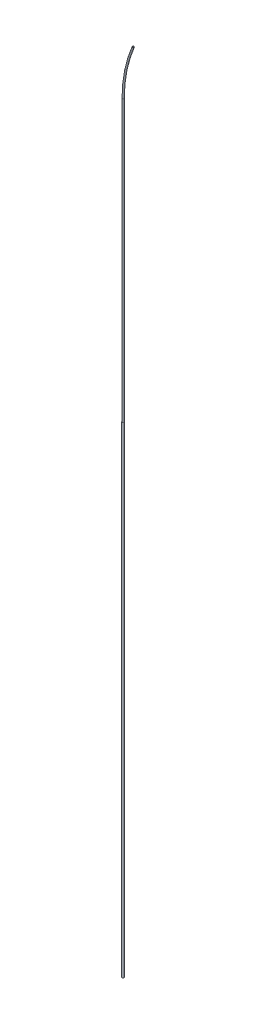
ISO-10303-21;
HEADER;
FILE_DESCRIPTION(('STEP AP214'),'2;1');
FILE_NAME('part.step','',(''),(''),'','','');
FILE_SCHEMA(('AUTOMOTIVE_DESIGN { 1 0 10303 214 1 1 1 1 }'));
ENDSEC;
DATA;
#1=APPLICATION_CONTEXT('core data for automotive mechanical design processes');
#2=APPLICATION_PROTOCOL_DEFINITION('international standard','automotive_design',2000,#1);
#3=PRODUCT_CONTEXT('',#1,'mechanical');
#4=PRODUCT('Part','Part','',(#3));
#5=PRODUCT_RELATED_PRODUCT_CATEGORY('part','',(#4));
#6=PRODUCT_DEFINITION_FORMATION('','',#4);
#7=PRODUCT_DEFINITION_CONTEXT('part definition',#1,'design');
#8=PRODUCT_DEFINITION('design','',#6,#7);
#9=PRODUCT_DEFINITION_SHAPE('','',#8);
#10=(LENGTH_UNIT() NAMED_UNIT(*) SI_UNIT(.MILLI.,.METRE.));
#11=(NAMED_UNIT(*) PLANE_ANGLE_UNIT() SI_UNIT($,.RADIAN.));
#12=(NAMED_UNIT(*) SI_UNIT($,.STERADIAN.) SOLID_ANGLE_UNIT());
#13=UNCERTAINTY_MEASURE_WITH_UNIT(LENGTH_MEASURE(1.E-05),#10,'distance_accuracy_value','');
#14=(GEOMETRIC_REPRESENTATION_CONTEXT(3) GLOBAL_UNCERTAINTY_ASSIGNED_CONTEXT((#13)) GLOBAL_UNIT_ASSIGNED_CONTEXT((#10,
#11,#12)) REPRESENTATION_CONTEXT('',''));
#15=CARTESIAN_POINT('',(0.,0.,0.));
#16=DIRECTION('',(0.,0.,1.));
#17=DIRECTION('',(1.,0.,0.));
#18=AXIS2_PLACEMENT_3D('',#15,#16,#17);
#19=CARTESIAN_POINT('',(0.,-368.,0.));
#20=DIRECTION('',(0.,-1.,0.));
#21=DIRECTION('',(0.,0.,-1.));
#22=AXIS2_PLACEMENT_3D('',#19,#20,#21);
#23=PLANE('',#22);
#24=CARTESIAN_POINT('',(0.,-368.,0.));
#25=DIRECTION('',(0.,-1.,0.));
#26=DIRECTION('',(0.,0.,-1.));
#27=AXIS2_PLACEMENT_3D('',#24,#25,#26);
#28=CIRCLE('',#27,0.8255);
#29=CARTESIAN_POINT('',(0.,-368.,-0.8255));
#30=VERTEX_POINT('',#29);
#31=EDGE_CURVE('E11',#30,#30,#28,.T.);
#32=ORIENTED_EDGE('',*,*,#31,.T.);
#33=EDGE_LOOP('',(#32));
#34=FACE_BOUND('',#33,.T.);
#35=CARTESIAN_POINT('',(0.,-368.,0.));
#36=DIRECTION('',(0.,-1.,0.));
#37=DIRECTION('',(0.,0.,-1.));
#38=AXIS2_PLACEMENT_3D('',#35,#36,#37);
#39=CIRCLE('',#38,0.673);
#40=CARTESIAN_POINT('',(0.,-368.,-0.673));
#41=VERTEX_POINT('',#40);
#42=EDGE_CURVE('E64',#41,#41,#39,.T.);
#43=ORIENTED_EDGE('',*,*,#42,.F.);
#44=EDGE_LOOP('',(#43));
#45=FACE_BOUND('',#44,.T.);
#46=ADVANCED_FACE('F51',(#34,#45),#23,.T.);
#47=CARTESIAN_POINT('',(0.,10.,0.));
#48=DIRECTION('',(0.,-1.,0.));
#49=DIRECTION('',(0.,0.,-1.));
#50=AXIS2_PLACEMENT_3D('',#47,#48,#49);
#51=PLANE('',#50);
#52=CARTESIAN_POINT('',(0.,10.,0.));
#53=DIRECTION('',(0.,-1.,0.));
#54=DIRECTION('',(0.,0.,-1.));
#55=AXIS2_PLACEMENT_3D('',#52,#53,#54);
#56=CIRCLE('',#55,0.8255);
#57=CARTESIAN_POINT('',(0.,10.,-0.8255));
#58=VERTEX_POINT('',#57);
#59=EDGE_CURVE('E55',#58,#58,#56,.T.);
#60=ORIENTED_EDGE('',*,*,#59,.F.);
#61=EDGE_LOOP('',(#60));
#62=FACE_BOUND('',#61,.T.);
#63=CARTESIAN_POINT('',(0.,10.,0.));
#64=DIRECTION('',(0.,-1.,0.));
#65=DIRECTION('',(0.,0.,-1.));
#66=AXIS2_PLACEMENT_3D('',#63,#64,#65);
#67=CIRCLE('',#66,0.673);
#68=CARTESIAN_POINT('',(0.,10.,-0.673));
#69=VERTEX_POINT('',#68);
#70=EDGE_CURVE('E66',#69,#69,#67,.T.);
#71=ORIENTED_EDGE('',*,*,#70,.T.);
#72=EDGE_LOOP('',(#71));
#73=FACE_BOUND('',#72,.T.);
#74=ADVANCED_FACE('F78',(#62,#73),#51,.F.);
#75=CARTESIAN_POINT('',(0.,-368.,0.));
#76=DIRECTION('',(0.,1.,0.));
#77=DIRECTION('',(0.,0.,1.));
#78=AXIS2_PLACEMENT_3D('',#75,#76,#77);
#79=CYLINDRICAL_SURFACE('',#78,0.8255);
#80=ORIENTED_EDGE('',*,*,#31,.F.);
#81=EDGE_LOOP('',(#80));
#82=FACE_BOUND('',#81,.T.);
#83=ORIENTED_EDGE('',*,*,#59,.T.);
#84=EDGE_LOOP('',(#83));
#85=FACE_BOUND('',#84,.T.);
#86=ADVANCED_FACE('F53',(#82,#85),#79,.T.);
#87=CARTESIAN_POINT('',(0.,-368.,0.));
#88=DIRECTION('',(0.,1.,0.));
#89=DIRECTION('',(0.,0.,1.));
#90=AXIS2_PLACEMENT_3D('',#87,#88,#89);
#91=CYLINDRICAL_SURFACE('',#90,0.673);
#92=ORIENTED_EDGE('',*,*,#42,.T.);
#93=EDGE_LOOP('',(#92));
#94=FACE_BOUND('',#93,.T.);
#95=ORIENTED_EDGE('',*,*,#70,.F.);
#96=EDGE_LOOP('',(#95));
#97=FACE_BOUND('',#96,.T.);
#98=ADVANCED_FACE('F74',(#94,#97),#91,.F.);
#99=CLOSED_SHELL('',(#46,#74,#86,#98));
#100=MANIFOLD_SOLID_BREP('B2',#99);
#101=CARTESIAN_POINT('',(0.,0.,0.));
#102=DIRECTION('',(0.,1.,0.));
#103=DIRECTION('',(0.,0.,1.));
#104=AXIS2_PLACEMENT_3D('',#101,#102,#103);
#105=PLANE('',#104);
#106=CARTESIAN_POINT('',(0.,0.,0.));
#107=DIRECTION('',(0.,1.,0.));
#108=DIRECTION('',(0.,0.,1.));
#109=AXIS2_PLACEMENT_3D('',#106,#107,#108);
#110=CIRCLE('',#109,0.635);
#111=CARTESIAN_POINT('',(0.,0.,0.635));
#112=VERTEX_POINT('',#111);
#113=EDGE_CURVE('E121',#112,#112,#110,.T.);
#114=ORIENTED_EDGE('',*,*,#113,.F.);
#115=EDGE_LOOP('',(#114));
#116=FACE_BOUND('',#115,.T.);
#117=CARTESIAN_POINT('',(0.,0.,0.));
#118=DIRECTION('',(0.,1.,0.));
#119=DIRECTION('',(0.,0.,1.));
#120=AXIS2_PLACEMENT_3D('',#117,#118,#119);
#121=CIRCLE('',#120,0.498);
#122=CARTESIAN_POINT('',(0.,0.,0.498));
#123=VERTEX_POINT('',#122);
#124=EDGE_CURVE('E128',#123,#123,#121,.T.);
#125=ORIENTED_EDGE('',*,*,#124,.T.);
#126=EDGE_LOOP('',(#125));
#127=FACE_BOUND('',#126,.T.);
#128=ADVANCED_FACE('F117',(#116,#127),#105,.F.);
#129=CARTESIAN_POINT('',(0.,230.,0.));
#130=DIRECTION('',(0.,-1.,0.));
#131=DIRECTION('',(0.,0.,-1.));
#132=AXIS2_PLACEMENT_3D('',#129,#130,#131);
#133=CYLINDRICAL_SURFACE('',#132,0.635);
#134=CARTESIAN_POINT('',(0.,230.,0.));
#135=DIRECTION('',(0.,1.,0.));
#136=DIRECTION('',(0.,0.,1.));
#137=AXIS2_PLACEMENT_3D('',#134,#135,#136);
#138=CIRCLE('',#137,0.635);
#139=CARTESIAN_POINT('',(-0.634999999999997,230.,0.));
#140=VERTEX_POINT('',#139);
#141=EDGE_CURVE('E50',#140,#140,#138,.T.);
#142=ORIENTED_EDGE('',*,*,#141,.F.);
#143=EDGE_LOOP('',(#142));
#144=FACE_BOUND('',#143,.T.);
#145=ORIENTED_EDGE('',*,*,#113,.T.);
#146=EDGE_LOOP('',(#145));
#147=FACE_BOUND('',#146,.T.);
#148=ADVANCED_FACE('F119',(#144,#147),#133,.T.);
#149=CARTESIAN_POINT('',(0.,230.,0.));
#150=DIRECTION('',(0.,-1.,0.));
#151=DIRECTION('',(0.,0.,-1.));
#152=AXIS2_PLACEMENT_3D('',#149,#150,#151);
#153=CYLINDRICAL_SURFACE('',#152,0.498);
#154=CARTESIAN_POINT('',(0.,230.,0.));
#155=DIRECTION('',(0.,1.,0.));
#156=DIRECTION('',(0.,0.,1.));
#157=AXIS2_PLACEMENT_3D('',#154,#155,#156);
#158=CIRCLE('',#157,0.498);
#159=CARTESIAN_POINT('',(-0.497999999999998,230.,0.));
#160=VERTEX_POINT('',#159);
#161=EDGE_CURVE('E136',#160,#160,#158,.F.);
#162=ORIENTED_EDGE('',*,*,#161,.F.);
#163=EDGE_LOOP('',(#162));
#164=FACE_BOUND('',#163,.T.);
#165=ORIENTED_EDGE('',*,*,#124,.F.);
#166=EDGE_LOOP('',(#165));
#167=FACE_BOUND('',#166,.T.);
#168=ADVANCED_FACE('F144',(#164,#167),#153,.F.);
#169=CARTESIAN_POINT('',(100.,230.,0.));
#170=DIRECTION('',(0.,0.,-1.));
#171=DIRECTION('',(-1.,0.,0.));
#172=AXIS2_PLACEMENT_3D('',#169,#170,#171);
#173=TOROIDAL_SURFACE('',#172,100.,0.635);
#174=CARTESIAN_POINT('',(7.89390059971148,268.941834230865,0.));
#175=DIRECTION('',(0.38941834230865,0.921060994002885,0.));
#176=DIRECTION('',(0.,0.,1.));
#177=AXIS2_PLACEMENT_3D('',#174,#175,#176);
#178=CIRCLE('',#177,0.635);
#179=CARTESIAN_POINT('',(7.30902686851966,269.189114878231,0.));
#180=VERTEX_POINT('',#179);
#181=EDGE_CURVE('E133',#180,#180,#178,.T.);
#182=CARTESIAN_POINT('',(100.,230.,0.));
#183=DIRECTION('',(0.,0.,-1.));
#184=DIRECTION('',(-1.,0.,0.));
#185=AXIS2_PLACEMENT_3D('',#182,#183,#184);
#186=CIRCLE('',#185,100.635);
#187=EDGE_CURVE('',#140,#180,#186,.T.);
#188=ORIENTED_EDGE('',*,*,#141,.T.);
#189=ORIENTED_EDGE('',*,*,#181,.F.);
#190=ORIENTED_EDGE('',*,*,#187,.T.);
#191=ORIENTED_EDGE('',*,*,#187,.F.);
#192=EDGE_LOOP('',(#188,#190,#189,#191));
#193=FACE_BOUND('',#192,.T.);
#194=ADVANCED_FACE('F147',(#193),#173,.T.);
#195=CARTESIAN_POINT('',(7.89390059971148,268.941834230865,0.));
#196=DIRECTION('',(0.38941834230865,0.921060994002885,0.));
#197=DIRECTION('',(0.,0.,1.));
#198=AXIS2_PLACEMENT_3D('',#195,#196,#197);
#199=PLANE('',#198);
#200=CARTESIAN_POINT('',(7.89390059971148,268.941834230865,0.));
#201=DIRECTION('',(0.38941834230865,0.921060994002885,0.));
#202=DIRECTION('',(0.,0.,1.));
#203=AXIS2_PLACEMENT_3D('',#200,#201,#202);
#204=CIRCLE('',#203,0.498);
#205=CARTESIAN_POINT('',(7.43521222469805,269.135764565335,0.));
#206=VERTEX_POINT('',#205);
#207=EDGE_CURVE('E132',#206,#206,#204,.F.);
#208=ORIENTED_EDGE('',*,*,#207,.T.);
#209=EDGE_LOOP('',(#208));
#210=FACE_BOUND('',#209,.T.);
#211=ORIENTED_EDGE('',*,*,#181,.T.);
#212=EDGE_LOOP('',(#211));
#213=FACE_BOUND('',#212,.T.);
#214=ADVANCED_FACE('F161',(#210,#213),#199,.T.);
#215=CARTESIAN_POINT('',(100.,230.,0.));
#216=DIRECTION('',(0.,0.,-1.));
#217=DIRECTION('',(-1.,0.,0.));
#218=AXIS2_PLACEMENT_3D('',#215,#216,#217);
#219=TOROIDAL_SURFACE('',#218,100.,0.498);
#220=CARTESIAN_POINT('',(100.,230.,0.));
#221=DIRECTION('',(0.,0.,-1.));
#222=DIRECTION('',(-1.,0.,0.));
#223=AXIS2_PLACEMENT_3D('',#220,#221,#222);
#224=CIRCLE('',#223,100.498);
#225=EDGE_CURVE('',#160,#206,#224,.T.);
#226=ORIENTED_EDGE('',*,*,#161,.T.);
#227=ORIENTED_EDGE('',*,*,#207,.F.);
#228=ORIENTED_EDGE('',*,*,#225,.T.);
#229=ORIENTED_EDGE('',*,*,#225,.F.);
#230=EDGE_LOOP('',(#226,#228,#227,#229));
#231=FACE_BOUND('',#230,.T.);
#232=ADVANCED_FACE('F142',(#231),#219,.F.);
#233=CLOSED_SHELL('',(#128,#148,#168,#194,#214,#232));
#234=MANIFOLD_SOLID_BREP('B6',#233);
#235=ADVANCED_BREP_SHAPE_REPRESENTATION('',(#18,#100,#234),#14);
#236=SHAPE_DEFINITION_REPRESENTATION(#9,#235);
ENDSEC;
END-ISO-10303-21;
